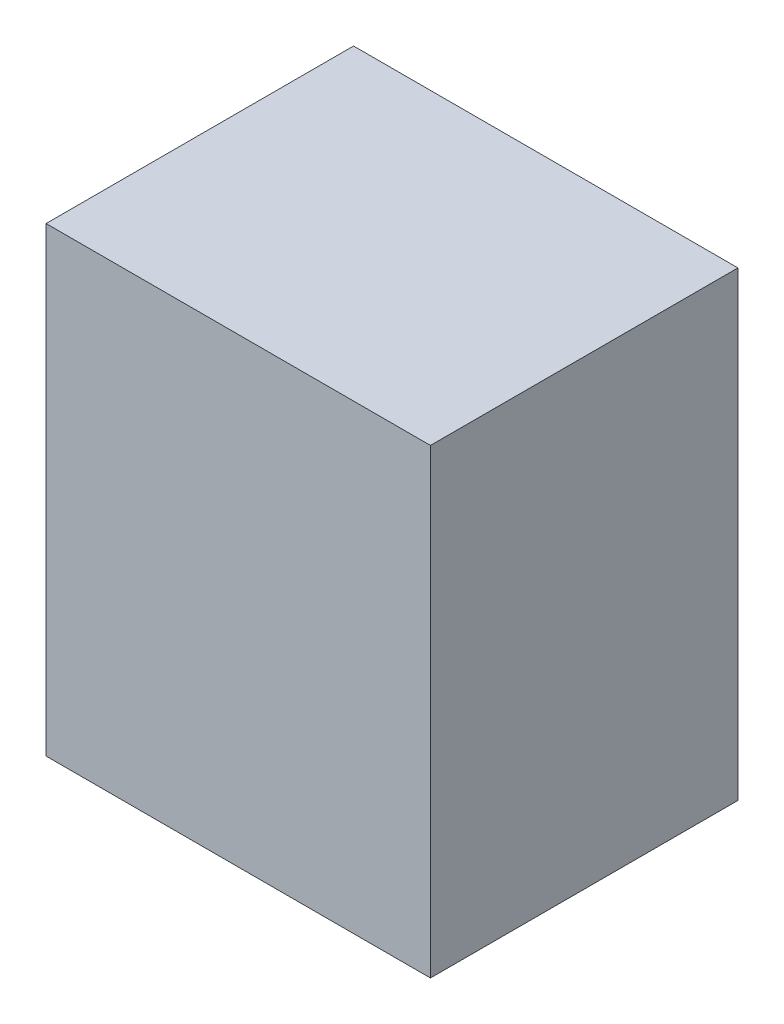
ISO-10303-21;
HEADER;
FILE_DESCRIPTION(('STEP AP214'),'2;1');
FILE_NAME('part.step','',(''),(''),'','','');
FILE_SCHEMA(('AUTOMOTIVE_DESIGN { 1 0 10303 214 1 1 1 1 }'));
ENDSEC;
DATA;
#1=APPLICATION_CONTEXT('core data for automotive mechanical design processes');
#2=APPLICATION_PROTOCOL_DEFINITION('international standard','automotive_design',2000,#1);
#3=PRODUCT_CONTEXT('',#1,'mechanical');
#4=PRODUCT('Part','Part','',(#3));
#5=PRODUCT_RELATED_PRODUCT_CATEGORY('part','',(#4));
#6=PRODUCT_DEFINITION_FORMATION('','',#4);
#7=PRODUCT_DEFINITION_CONTEXT('part definition',#1,'design');
#8=PRODUCT_DEFINITION('design','',#6,#7);
#9=PRODUCT_DEFINITION_SHAPE('','',#8);
#10=(LENGTH_UNIT() NAMED_UNIT(*) SI_UNIT(.MILLI.,.METRE.));
#11=(NAMED_UNIT(*) PLANE_ANGLE_UNIT() SI_UNIT($,.RADIAN.));
#12=(NAMED_UNIT(*) SI_UNIT($,.STERADIAN.) SOLID_ANGLE_UNIT());
#13=UNCERTAINTY_MEASURE_WITH_UNIT(LENGTH_MEASURE(1.E-05),#10,'distance_accuracy_value','');
#14=(GEOMETRIC_REPRESENTATION_CONTEXT(3) GLOBAL_UNCERTAINTY_ASSIGNED_CONTEXT((#13)) GLOBAL_UNIT_ASSIGNED_CONTEXT((#10,
#11,#12)) REPRESENTATION_CONTEXT('',''));
#15=CARTESIAN_POINT('',(0.,0.,0.));
#16=DIRECTION('',(0.,0.,1.));
#17=DIRECTION('',(1.,0.,0.));
#18=AXIS2_PLACEMENT_3D('',#15,#16,#17);
#19=CARTESIAN_POINT('',(0.,0.,80.));
#20=DIRECTION('',(1.,0.,0.));
#21=DIRECTION('',(0.,0.,-1.));
#22=AXIS2_PLACEMENT_3D('',#19,#20,#21);
#23=PLANE('',#22);
#24=DIRECTION('',(0.,-1.,0.));
#25=VECTOR('',#24,1.);
#26=CARTESIAN_POINT('',(0.,0.,0.));
#27=LINE('',#26,#25);
#28=CARTESIAN_POINT('',(0.,120.,0.));
#29=VERTEX_POINT('',#28);
#30=CARTESIAN_POINT('',(0.,0.,0.));
#31=VERTEX_POINT('',#30);
#32=EDGE_CURVE('E95',#29,#31,#27,.T.);
#33=ORIENTED_EDGE('',*,*,#32,.T.);
#34=DIRECTION('',(0.,0.,-1.));
#35=VECTOR('',#34,1.);
#36=CARTESIAN_POINT('',(0.,0.,80.));
#37=LINE('',#36,#35);
#38=CARTESIAN_POINT('',(0.,0.,80.));
#39=VERTEX_POINT('',#38);
#40=EDGE_CURVE('E11',#39,#31,#37,.T.);
#41=ORIENTED_EDGE('',*,*,#40,.F.);
#42=DIRECTION('',(0.,-1.,0.));
#43=VECTOR('',#42,1.);
#44=CARTESIAN_POINT('',(0.,0.,80.));
#45=LINE('',#44,#43);
#46=CARTESIAN_POINT('',(0.,120.,80.));
#47=VERTEX_POINT('',#46);
#48=EDGE_CURVE('E83',#47,#39,#45,.T.);
#49=ORIENTED_EDGE('',*,*,#48,.F.);
#50=DIRECTION('',(0.,0.,-1.));
#51=VECTOR('',#50,1.);
#52=CARTESIAN_POINT('',(0.,120.,80.));
#53=LINE('',#52,#51);
#54=EDGE_CURVE('E91',#47,#29,#53,.T.);
#55=ORIENTED_EDGE('',*,*,#54,.T.);
#56=EDGE_LOOP('',(#33,#41,#49,#55));
#57=FACE_BOUND('',#56,.T.);
#58=ADVANCED_FACE('F32',(#57),#23,.F.);
#59=CARTESIAN_POINT('',(0.,0.,80.));
#60=DIRECTION('',(0.,1.,0.));
#61=DIRECTION('',(0.,0.,1.));
#62=AXIS2_PLACEMENT_3D('',#59,#60,#61);
#63=PLANE('',#62);
#64=DIRECTION('',(1.,0.,0.));
#65=VECTOR('',#64,1.);
#66=CARTESIAN_POINT('',(0.,0.,0.));
#67=LINE('',#66,#65);
#68=CARTESIAN_POINT('',(100.,0.,0.));
#69=VERTEX_POINT('',#68);
#70=EDGE_CURVE('E87',#31,#69,#67,.T.);
#71=ORIENTED_EDGE('',*,*,#70,.T.);
#72=DIRECTION('',(0.,0.,-1.));
#73=VECTOR('',#72,1.);
#74=CARTESIAN_POINT('',(100.,0.,80.));
#75=LINE('',#74,#73);
#76=CARTESIAN_POINT('',(100.,0.,80.));
#77=VERTEX_POINT('',#76);
#78=EDGE_CURVE('E40',#77,#69,#75,.T.);
#79=ORIENTED_EDGE('',*,*,#78,.F.);
#80=DIRECTION('',(1.,0.,0.));
#81=VECTOR('',#80,1.);
#82=CARTESIAN_POINT('',(0.,0.,80.));
#83=LINE('',#82,#81);
#84=EDGE_CURVE('E78',#39,#77,#83,.T.);
#85=ORIENTED_EDGE('',*,*,#84,.F.);
#86=ORIENTED_EDGE('',*,*,#40,.T.);
#87=EDGE_LOOP('',(#71,#79,#85,#86));
#88=FACE_BOUND('',#87,.T.);
#89=ADVANCED_FACE('F86',(#88),#63,.F.);
#90=CARTESIAN_POINT('',(100.,0.,80.));
#91=DIRECTION('',(-1.,0.,0.));
#92=DIRECTION('',(0.,0.,1.));
#93=AXIS2_PLACEMENT_3D('',#90,#91,#92);
#94=PLANE('',#93);
#95=DIRECTION('',(0.,1.,0.));
#96=VECTOR('',#95,1.);
#97=CARTESIAN_POINT('',(100.,0.,0.));
#98=LINE('',#97,#96);
#99=CARTESIAN_POINT('',(100.,120.,0.));
#100=VERTEX_POINT('',#99);
#101=EDGE_CURVE('E65',#69,#100,#98,.T.);
#102=ORIENTED_EDGE('',*,*,#101,.T.);
#103=DIRECTION('',(0.,0.,-1.));
#104=VECTOR('',#103,1.);
#105=CARTESIAN_POINT('',(100.,120.,80.));
#106=LINE('',#105,#104);
#107=CARTESIAN_POINT('',(100.,120.,80.));
#108=VERTEX_POINT('',#107);
#109=EDGE_CURVE('E88',#108,#100,#106,.T.);
#110=ORIENTED_EDGE('',*,*,#109,.F.);
#111=DIRECTION('',(0.,1.,0.));
#112=VECTOR('',#111,1.);
#113=CARTESIAN_POINT('',(100.,0.,80.));
#114=LINE('',#113,#112);
#115=EDGE_CURVE('E81',#77,#108,#114,.T.);
#116=ORIENTED_EDGE('',*,*,#115,.F.);
#117=ORIENTED_EDGE('',*,*,#78,.T.);
#118=EDGE_LOOP('',(#102,#110,#116,#117));
#119=FACE_BOUND('',#118,.T.);
#120=ADVANCED_FACE('F89',(#119),#94,.F.);
#121=CARTESIAN_POINT('',(0.,120.,80.));
#122=DIRECTION('',(0.,-1.,0.));
#123=DIRECTION('',(0.,0.,-1.));
#124=AXIS2_PLACEMENT_3D('',#121,#122,#123);
#125=PLANE('',#124);
#126=DIRECTION('',(-1.,0.,0.));
#127=VECTOR('',#126,1.);
#128=CARTESIAN_POINT('',(0.,120.,0.));
#129=LINE('',#128,#127);
#130=EDGE_CURVE('E71',#100,#29,#129,.T.);
#131=ORIENTED_EDGE('',*,*,#130,.T.);
#132=ORIENTED_EDGE('',*,*,#54,.F.);
#133=DIRECTION('',(-1.,0.,0.));
#134=VECTOR('',#133,1.);
#135=CARTESIAN_POINT('',(0.,120.,80.));
#136=LINE('',#135,#134);
#137=EDGE_CURVE('E48',#108,#47,#136,.T.);
#138=ORIENTED_EDGE('',*,*,#137,.F.);
#139=ORIENTED_EDGE('',*,*,#109,.T.);
#140=EDGE_LOOP('',(#131,#132,#138,#139));
#141=FACE_BOUND('',#140,.T.);
#142=ADVANCED_FACE('F102',(#141),#125,.F.);
#143=CARTESIAN_POINT('',(0.,0.,80.));
#144=DIRECTION('',(0.,0.,-1.));
#145=DIRECTION('',(-1.,0.,0.));
#146=AXIS2_PLACEMENT_3D('',#143,#144,#145);
#147=PLANE('',#146);
#148=ORIENTED_EDGE('',*,*,#48,.T.);
#149=ORIENTED_EDGE('',*,*,#84,.T.);
#150=ORIENTED_EDGE('',*,*,#115,.T.);
#151=ORIENTED_EDGE('',*,*,#137,.T.);
#152=EDGE_LOOP('',(#148,#149,#150,#151));
#153=FACE_BOUND('',#152,.T.);
#154=ADVANCED_FACE('F79',(#153),#147,.F.);
#155=CARTESIAN_POINT('',(0.,0.,0.));
#156=DIRECTION('',(0.,0.,-1.));
#157=DIRECTION('',(-1.,0.,0.));
#158=AXIS2_PLACEMENT_3D('',#155,#156,#157);
#159=PLANE('',#158);
#160=ORIENTED_EDGE('',*,*,#32,.F.);
#161=ORIENTED_EDGE('',*,*,#130,.F.);
#162=ORIENTED_EDGE('',*,*,#101,.F.);
#163=ORIENTED_EDGE('',*,*,#70,.F.);
#164=EDGE_LOOP('',(#160,#161,#162,#163));
#165=FACE_BOUND('',#164,.T.);
#166=ADVANCED_FACE('F105',(#165),#159,.T.);
#167=CLOSED_SHELL('',(#58,#89,#120,#142,#154,#166));
#168=MANIFOLD_SOLID_BREP('B2',#167);
#169=ADVANCED_BREP_SHAPE_REPRESENTATION('',(#18,#168),#14);
#170=SHAPE_DEFINITION_REPRESENTATION(#9,#169);
ENDSEC;
END-ISO-10303-21;
